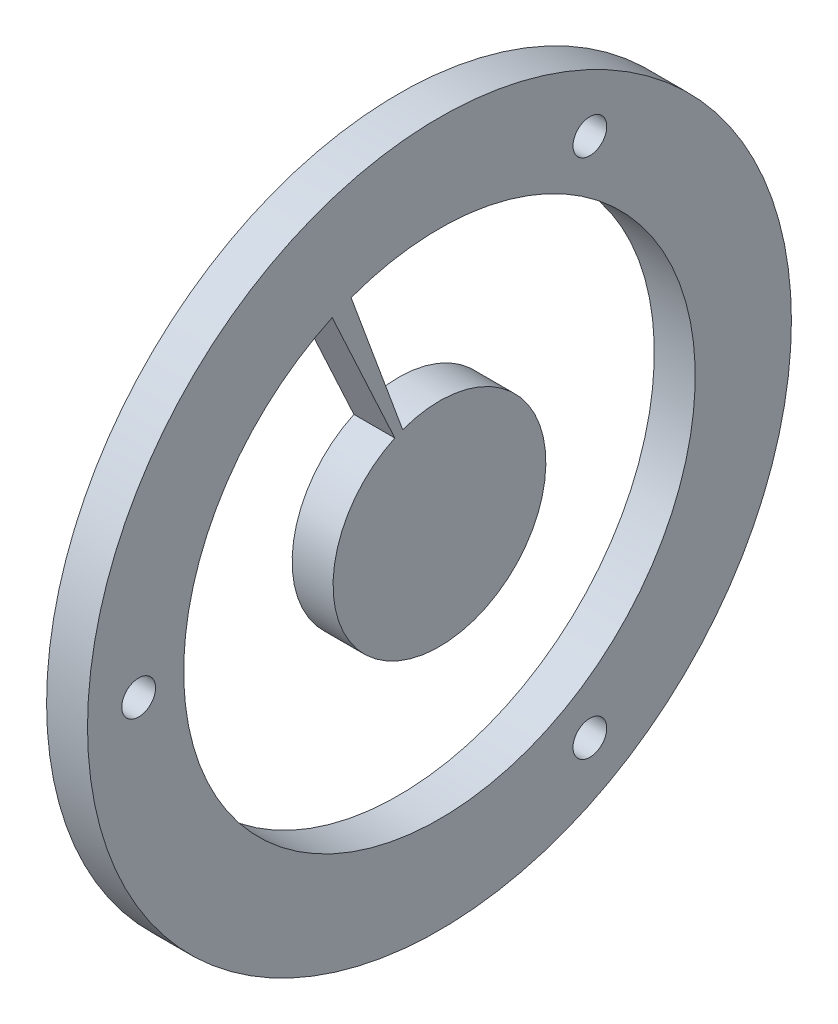
ISO-10303-21;
HEADER;
FILE_DESCRIPTION(('STEP AP214'),'2;1');
FILE_NAME('part.step','',(''),(''),'','','');
FILE_SCHEMA(('AUTOMOTIVE_DESIGN { 1 0 10303 214 1 1 1 1 }'));
ENDSEC;
DATA;
#1=APPLICATION_CONTEXT('core data for automotive mechanical design processes');
#2=APPLICATION_PROTOCOL_DEFINITION('international standard','automotive_design',2000,#1);
#3=PRODUCT_CONTEXT('',#1,'mechanical');
#4=PRODUCT('Part','Part','',(#3));
#5=PRODUCT_RELATED_PRODUCT_CATEGORY('part','',(#4));
#6=PRODUCT_DEFINITION_FORMATION('','',#4);
#7=PRODUCT_DEFINITION_CONTEXT('part definition',#1,'design');
#8=PRODUCT_DEFINITION('design','',#6,#7);
#9=PRODUCT_DEFINITION_SHAPE('','',#8);
#10=(LENGTH_UNIT() NAMED_UNIT(*) SI_UNIT(.MILLI.,.METRE.));
#11=(NAMED_UNIT(*) PLANE_ANGLE_UNIT() SI_UNIT($,.RADIAN.));
#12=(NAMED_UNIT(*) SI_UNIT($,.STERADIAN.) SOLID_ANGLE_UNIT());
#13=UNCERTAINTY_MEASURE_WITH_UNIT(LENGTH_MEASURE(1.E-05),#10,'distance_accuracy_value','');
#14=(GEOMETRIC_REPRESENTATION_CONTEXT(3) GLOBAL_UNCERTAINTY_ASSIGNED_CONTEXT((#13)) GLOBAL_UNIT_ASSIGNED_CONTEXT((#10,
#11,#12)) REPRESENTATION_CONTEXT('',''));
#15=CARTESIAN_POINT('',(0.,0.,0.));
#16=DIRECTION('',(0.,0.,1.));
#17=DIRECTION('',(1.,0.,0.));
#18=AXIS2_PLACEMENT_3D('',#15,#16,#17);
#19=CARTESIAN_POINT('',(159.7,-25.46114687126,-14.7));
#20=DIRECTION('',(1.,0.,0.));
#21=DIRECTION('',(0.,0.,1.));
#22=AXIS2_PLACEMENT_3D('',#19,#20,#21);
#23=CYLINDRICAL_SURFACE('',#22,1.65);
#24=DIRECTION('',(1.,0.,0.));
#25=VECTOR('',#24,1.);
#26=CARTESIAN_POINT('',(159.7,-25.46114687126,-13.05));
#27=LINE('',#26,#25);
#28=CARTESIAN_POINT('',(159.7,-25.46114687126,-13.05));
#29=VERTEX_POINT('',#28);
#30=CARTESIAN_POINT('',(163.7,-25.46114687126,-13.05));
#31=VERTEX_POINT('',#30);
#32=EDGE_CURVE('E10',#29,#31,#27,.T.);
#33=ORIENTED_EDGE('',*,*,#32,.F.);
#34=CARTESIAN_POINT('',(159.7,-25.46114687126,-14.7));
#35=DIRECTION('',(1.,0.,0.));
#36=DIRECTION('',(0.,0.,1.));
#37=AXIS2_PLACEMENT_3D('',#34,#35,#36);
#38=CIRCLE('',#37,1.65);
#39=EDGE_CURVE('E155',#29,#29,#38,.T.);
#40=ORIENTED_EDGE('',*,*,#39,.F.);
#41=ORIENTED_EDGE('',*,*,#32,.T.);
#42=CARTESIAN_POINT('',(163.7,-25.46114687126,-14.7));
#43=DIRECTION('',(1.,0.,0.));
#44=DIRECTION('',(0.,0.,1.));
#45=AXIS2_PLACEMENT_3D('',#42,#43,#44);
#46=CIRCLE('',#45,1.65);
#47=EDGE_CURVE('E172',#31,#31,#46,.T.);
#48=ORIENTED_EDGE('',*,*,#47,.T.);
#49=EDGE_LOOP('',(#33,#40,#41,#48));
#50=FACE_BOUND('',#49,.T.);
#51=ADVANCED_FACE('F16',(#50),#23,.F.);
#52=CARTESIAN_POINT('',(159.7,0.,29.4));
#53=DIRECTION('',(1.,0.,0.));
#54=DIRECTION('',(0.,0.,1.));
#55=AXIS2_PLACEMENT_3D('',#52,#53,#54);
#56=CYLINDRICAL_SURFACE('',#55,1.65);
#57=DIRECTION('',(1.,0.,0.));
#58=VECTOR('',#57,1.);
#59=CARTESIAN_POINT('',(159.7,0.,31.05));
#60=LINE('',#59,#58);
#61=CARTESIAN_POINT('',(159.7,0.,31.05));
#62=VERTEX_POINT('',#61);
#63=CARTESIAN_POINT('',(163.7,0.,31.05));
#64=VERTEX_POINT('',#63);
#65=EDGE_CURVE('E26',#62,#64,#60,.T.);
#66=ORIENTED_EDGE('',*,*,#65,.F.);
#67=CARTESIAN_POINT('',(159.7,0.,29.4));
#68=DIRECTION('',(1.,0.,0.));
#69=DIRECTION('',(0.,0.,1.));
#70=AXIS2_PLACEMENT_3D('',#67,#68,#69);
#71=CIRCLE('',#70,1.65);
#72=EDGE_CURVE('E151',#62,#62,#71,.T.);
#73=ORIENTED_EDGE('',*,*,#72,.F.);
#74=ORIENTED_EDGE('',*,*,#65,.T.);
#75=CARTESIAN_POINT('',(163.7,0.,29.4));
#76=DIRECTION('',(1.,0.,0.));
#77=DIRECTION('',(0.,0.,1.));
#78=AXIS2_PLACEMENT_3D('',#75,#76,#77);
#79=CIRCLE('',#78,1.65);
#80=EDGE_CURVE('E139',#64,#64,#79,.T.);
#81=ORIENTED_EDGE('',*,*,#80,.T.);
#82=EDGE_LOOP('',(#66,#73,#74,#81));
#83=FACE_BOUND('',#82,.T.);
#84=ADVANCED_FACE('F196',(#83),#56,.F.);
#85=CARTESIAN_POINT('',(159.7,0.,0.));
#86=DIRECTION('',(-1.,0.,0.));
#87=DIRECTION('',(0.,0.938443783091679,0.345431999062881));
#88=AXIS2_PLACEMENT_3D('',#85,#86,#87);
#89=CYLINDRICAL_SURFACE('',#88,10.4);
#90=DIRECTION('',(1.,0.,0.));
#91=VECTOR('',#90,1.);
#92=CARTESIAN_POINT('',(159.7,9.759815344154,3.592492790253));
#93=LINE('',#92,#91);
#94=CARTESIAN_POINT('',(159.7,9.759815344154,3.592492790253));
#95=VERTEX_POINT('',#94);
#96=CARTESIAN_POINT('',(163.7,9.759815344154,3.592492790253));
#97=VERTEX_POINT('',#96);
#98=EDGE_CURVE('E140',#95,#97,#93,.T.);
#99=ORIENTED_EDGE('',*,*,#98,.T.);
#100=CARTESIAN_POINT('',(163.7,0.,0.));
#101=DIRECTION('',(-1.,0.,0.));
#102=DIRECTION('',(0.,0.938443783091679,0.345431999062881));
#103=AXIS2_PLACEMENT_3D('',#100,#101,#102);
#104=CIRCLE('',#103,10.4);
#105=CARTESIAN_POINT('',(163.7,9.441507626331,4.360955599628));
#106=VERTEX_POINT('',#105);
#107=EDGE_CURVE('E120',#97,#106,#104,.T.);
#108=ORIENTED_EDGE('',*,*,#107,.T.);
#109=DIRECTION('',(1.,0.,0.));
#110=VECTOR('',#109,1.);
#111=CARTESIAN_POINT('',(159.7,9.441507626331,4.360955599628));
#112=LINE('',#111,#110);
#113=CARTESIAN_POINT('',(159.7,9.441507626331,4.360955599628));
#114=VERTEX_POINT('',#113);
#115=EDGE_CURVE('E115',#114,#106,#112,.T.);
#116=ORIENTED_EDGE('',*,*,#115,.F.);
#117=CARTESIAN_POINT('',(159.7,0.,0.));
#118=DIRECTION('',(-1.,0.,0.));
#119=DIRECTION('',(0.,0.938443783091679,0.345431999062881));
#120=AXIS2_PLACEMENT_3D('',#117,#118,#119);
#121=CIRCLE('',#120,10.4);
#122=EDGE_CURVE('E150',#95,#114,#121,.T.);
#123=ORIENTED_EDGE('',*,*,#122,.F.);
#124=EDGE_LOOP('',(#99,#108,#116,#123));
#125=FACE_BOUND('',#124,.T.);
#126=ADVANCED_FACE('F219',(#125),#89,.T.);
#127=CARTESIAN_POINT('',(159.7,23.461094577293,8.63579997657));
#128=DIRECTION('',(0.,0.345431999062881,-0.938443783091679));
#129=DIRECTION('',(-1.,0.,0.));
#130=AXIS2_PLACEMENT_3D('',#127,#128,#129);
#131=PLANE('',#130);
#132=DIRECTION('',(1.,0.,0.));
#133=VECTOR('',#132,1.);
#134=CARTESIAN_POINT('',(159.7,23.461094577293,8.63579997657));
#135=LINE('',#134,#133);
#136=CARTESIAN_POINT('',(159.7,23.461094577293,8.63579997657));
#137=VERTEX_POINT('',#136);
#138=CARTESIAN_POINT('',(163.7,23.461094577293,8.63579997657));
#139=VERTEX_POINT('',#138);
#140=EDGE_CURVE('E108',#137,#139,#135,.T.);
#141=ORIENTED_EDGE('',*,*,#140,.T.);
#142=DIRECTION('',(0.,-0.938443783091679,-0.345431999062881));
#143=VECTOR('',#142,1.);
#144=CARTESIAN_POINT('',(163.7,23.461094577293,8.63579997657));
#145=LINE('',#144,#143);
#146=EDGE_CURVE('E126',#139,#97,#145,.T.);
#147=ORIENTED_EDGE('',*,*,#146,.T.);
#148=ORIENTED_EDGE('',*,*,#98,.F.);
#149=DIRECTION('',(0.,-0.938443783091679,-0.345431999062881));
#150=VECTOR('',#149,1.);
#151=CARTESIAN_POINT('',(159.7,23.461094577293,8.63579997657));
#152=LINE('',#151,#150);
#153=EDGE_CURVE('E159',#137,#95,#152,.T.);
#154=ORIENTED_EDGE('',*,*,#153,.F.);
#155=EDGE_LOOP('',(#141,#147,#148,#154));
#156=FACE_BOUND('',#155,.T.);
#157=ADVANCED_FACE('F224',(#156),#131,.T.);
#158=CARTESIAN_POINT('',(159.7,9.441507626331,4.360955599628));
#159=DIRECTION('',(0.,-0.419322653809927,0.907837271762842));
#160=DIRECTION('',(-1.,0.,0.));
#161=AXIS2_PLACEMENT_3D('',#158,#159,#160);
#162=PLANE('',#161);
#163=ORIENTED_EDGE('',*,*,#115,.T.);
#164=DIRECTION('',(0.,0.907837271762842,0.419322653809927));
#165=VECTOR('',#164,1.);
#166=CARTESIAN_POINT('',(163.7,9.441507626331,4.360955599628));
#167=LINE('',#166,#165);
#168=CARTESIAN_POINT('',(163.7,22.695931794066,10.483066345259));
#169=VERTEX_POINT('',#168);
#170=EDGE_CURVE('E113',#106,#169,#167,.T.);
#171=ORIENTED_EDGE('',*,*,#170,.T.);
#172=DIRECTION('',(1.,0.,0.));
#173=VECTOR('',#172,1.);
#174=CARTESIAN_POINT('',(159.7,22.695931794066,10.483066345259));
#175=LINE('',#174,#173);
#176=CARTESIAN_POINT('',(159.7,22.695931794066,10.483066345259));
#177=VERTEX_POINT('',#176);
#178=EDGE_CURVE('E97',#177,#169,#175,.T.);
#179=ORIENTED_EDGE('',*,*,#178,.F.);
#180=DIRECTION('',(0.,0.907837271762842,0.419322653809927));
#181=VECTOR('',#180,1.);
#182=CARTESIAN_POINT('',(159.7,9.441507626331,4.360955599628));
#183=LINE('',#182,#181);
#184=EDGE_CURVE('E147',#114,#177,#183,.T.);
#185=ORIENTED_EDGE('',*,*,#184,.F.);
#186=EDGE_LOOP('',(#163,#171,#179,#185));
#187=FACE_BOUND('',#186,.T.);
#188=ADVANCED_FACE('F114',(#187),#162,.T.);
#189=CARTESIAN_POINT('',(159.7,0.,-1.265654248073E-13));
#190=DIRECTION('',(-1.,0.,0.));
#191=DIRECTION('',(0.,0.907837271762842,0.419322653809927));
#192=AXIS2_PLACEMENT_3D('',#189,#190,#191);
#193=CYLINDRICAL_SURFACE('',#192,25.);
#194=ORIENTED_EDGE('',*,*,#178,.T.);
#195=CARTESIAN_POINT('',(163.7,0.,-1.265654248073E-13));
#196=DIRECTION('',(1.,0.,0.));
#197=DIRECTION('',(0.,0.907837271762842,0.419322653809927));
#198=AXIS2_PLACEMENT_3D('',#195,#196,#197);
#199=CIRCLE('',#198,25.);
#200=EDGE_CURVE('E101',#169,#139,#199,.T.);
#201=ORIENTED_EDGE('',*,*,#200,.T.);
#202=ORIENTED_EDGE('',*,*,#140,.F.);
#203=CARTESIAN_POINT('',(159.7,0.,-1.265654248073E-13));
#204=DIRECTION('',(1.,0.,0.));
#205=DIRECTION('',(0.,0.907837271762842,0.419322653809927));
#206=AXIS2_PLACEMENT_3D('',#203,#204,#205);
#207=CIRCLE('',#206,25.);
#208=EDGE_CURVE('E103',#177,#137,#207,.T.);
#209=ORIENTED_EDGE('',*,*,#208,.F.);
#210=EDGE_LOOP('',(#194,#201,#202,#209));
#211=FACE_BOUND('',#210,.T.);
#212=ADVANCED_FACE('F99',(#211),#193,.F.);
#213=CARTESIAN_POINT('',(159.7,25.461146871262,-14.7));
#214=DIRECTION('',(1.,0.,0.));
#215=DIRECTION('',(0.,0.,1.));
#216=AXIS2_PLACEMENT_3D('',#213,#214,#215);
#217=CYLINDRICAL_SURFACE('',#216,1.65);
#218=DIRECTION('',(1.,0.,0.));
#219=VECTOR('',#218,1.);
#220=CARTESIAN_POINT('',(159.7,25.461146871262,-13.05));
#221=LINE('',#220,#219);
#222=CARTESIAN_POINT('',(159.7,25.461146871262,-13.05));
#223=VERTEX_POINT('',#222);
#224=CARTESIAN_POINT('',(163.7,25.461146871262,-13.05));
#225=VERTEX_POINT('',#224);
#226=EDGE_CURVE('E109',#223,#225,#221,.T.);
#227=ORIENTED_EDGE('',*,*,#226,.F.);
#228=CARTESIAN_POINT('',(159.7,25.461146871262,-14.7));
#229=DIRECTION('',(1.,0.,0.));
#230=DIRECTION('',(0.,0.,1.));
#231=AXIS2_PLACEMENT_3D('',#228,#229,#230);
#232=CIRCLE('',#231,1.65);
#233=EDGE_CURVE('E162',#223,#223,#232,.T.);
#234=ORIENTED_EDGE('',*,*,#233,.F.);
#235=ORIENTED_EDGE('',*,*,#226,.T.);
#236=CARTESIAN_POINT('',(163.7,25.461146871262,-14.7));
#237=DIRECTION('',(1.,0.,0.));
#238=DIRECTION('',(0.,0.,1.));
#239=AXIS2_PLACEMENT_3D('',#236,#237,#238);
#240=CIRCLE('',#239,1.65);
#241=EDGE_CURVE('E128',#225,#225,#240,.T.);
#242=ORIENTED_EDGE('',*,*,#241,.T.);
#243=EDGE_LOOP('',(#227,#234,#235,#242));
#244=FACE_BOUND('',#243,.T.);
#245=ADVANCED_FACE('F211',(#244),#217,.F.);
#246=CARTESIAN_POINT('',(159.7,0.,0.));
#247=DIRECTION('',(1.,0.,0.));
#248=DIRECTION('',(0.,1.,0.));
#249=AXIS2_PLACEMENT_3D('',#246,#247,#248);
#250=PLANE('',#249);
#251=ORIENTED_EDGE('',*,*,#39,.T.);
#252=EDGE_LOOP('',(#251));
#253=FACE_BOUND('',#252,.T.);
#254=ORIENTED_EDGE('',*,*,#72,.T.);
#255=EDGE_LOOP('',(#254));
#256=FACE_BOUND('',#255,.T.);
#257=ORIENTED_EDGE('',*,*,#153,.T.);
#258=ORIENTED_EDGE('',*,*,#122,.T.);
#259=ORIENTED_EDGE('',*,*,#184,.T.);
#260=ORIENTED_EDGE('',*,*,#208,.T.);
#261=EDGE_LOOP('',(#257,#258,#259,#260));
#262=FACE_BOUND('',#261,.T.);
#263=ORIENTED_EDGE('',*,*,#233,.T.);
#264=EDGE_LOOP('',(#263));
#265=FACE_BOUND('',#264,.T.);
#266=CARTESIAN_POINT('',(159.7,0.,0.));
#267=DIRECTION('',(1.,0.,0.));
#268=DIRECTION('',(0.,0.,1.));
#269=AXIS2_PLACEMENT_3D('',#266,#267,#268);
#270=CIRCLE('',#269,34.4);
#271=CARTESIAN_POINT('',(159.7,0.,34.4));
#272=VERTEX_POINT('',#271);
#273=EDGE_CURVE('E135',#272,#272,#270,.T.);
#274=ORIENTED_EDGE('',*,*,#273,.F.);
#275=EDGE_LOOP('',(#274));
#276=FACE_BOUND('',#275,.T.);
#277=ADVANCED_FACE('F201',(#253,#256,#262,#265,#276),#250,.F.);
#278=CARTESIAN_POINT('',(163.7,0.,0.));
#279=DIRECTION('',(1.,0.,0.));
#280=DIRECTION('',(0.,1.,0.));
#281=AXIS2_PLACEMENT_3D('',#278,#279,#280);
#282=PLANE('',#281);
#283=ORIENTED_EDGE('',*,*,#47,.F.);
#284=EDGE_LOOP('',(#283));
#285=FACE_BOUND('',#284,.T.);
#286=ORIENTED_EDGE('',*,*,#80,.F.);
#287=EDGE_LOOP('',(#286));
#288=FACE_BOUND('',#287,.T.);
#289=ORIENTED_EDGE('',*,*,#200,.F.);
#290=ORIENTED_EDGE('',*,*,#170,.F.);
#291=ORIENTED_EDGE('',*,*,#107,.F.);
#292=ORIENTED_EDGE('',*,*,#146,.F.);
#293=EDGE_LOOP('',(#289,#290,#291,#292));
#294=FACE_BOUND('',#293,.T.);
#295=ORIENTED_EDGE('',*,*,#241,.F.);
#296=EDGE_LOOP('',(#295));
#297=FACE_BOUND('',#296,.T.);
#298=CARTESIAN_POINT('',(163.7,0.,0.));
#299=DIRECTION('',(1.,0.,0.));
#300=DIRECTION('',(0.,0.,1.));
#301=AXIS2_PLACEMENT_3D('',#298,#299,#300);
#302=CIRCLE('',#301,34.4);
#303=CARTESIAN_POINT('',(163.7,0.,34.4));
#304=VERTEX_POINT('',#303);
#305=EDGE_CURVE('E19',#304,#304,#302,.T.);
#306=ORIENTED_EDGE('',*,*,#305,.T.);
#307=EDGE_LOOP('',(#306));
#308=FACE_BOUND('',#307,.T.);
#309=ADVANCED_FACE('F123',(#285,#288,#294,#297,#308),#282,.T.);
#310=CARTESIAN_POINT('',(159.7,0.,0.));
#311=DIRECTION('',(1.,0.,0.));
#312=DIRECTION('',(0.,0.,1.));
#313=AXIS2_PLACEMENT_3D('',#310,#311,#312);
#314=CYLINDRICAL_SURFACE('',#313,34.4);
#315=ORIENTED_EDGE('',*,*,#305,.F.);
#316=DIRECTION('',(1.,0.,0.));
#317=VECTOR('',#316,1.);
#318=CARTESIAN_POINT('',(159.7,0.,34.4));
#319=LINE('',#318,#317);
#320=EDGE_CURVE('E142',#272,#304,#319,.T.);
#321=ORIENTED_EDGE('',*,*,#320,.F.);
#322=ORIENTED_EDGE('',*,*,#273,.T.);
#323=ORIENTED_EDGE('',*,*,#320,.T.);
#324=EDGE_LOOP('',(#315,#321,#322,#323));
#325=FACE_BOUND('',#324,.T.);
#326=ADVANCED_FACE('F200',(#325),#314,.T.);
#327=CLOSED_SHELL('',(#51,#84,#126,#157,#188,#212,#245,#277,#309,#326));
#328=MANIFOLD_SOLID_BREP('B1',#327);
#329=ADVANCED_BREP_SHAPE_REPRESENTATION('',(#18,#328),#14);
#330=SHAPE_DEFINITION_REPRESENTATION(#9,#329);
ENDSEC;
END-ISO-10303-21;
